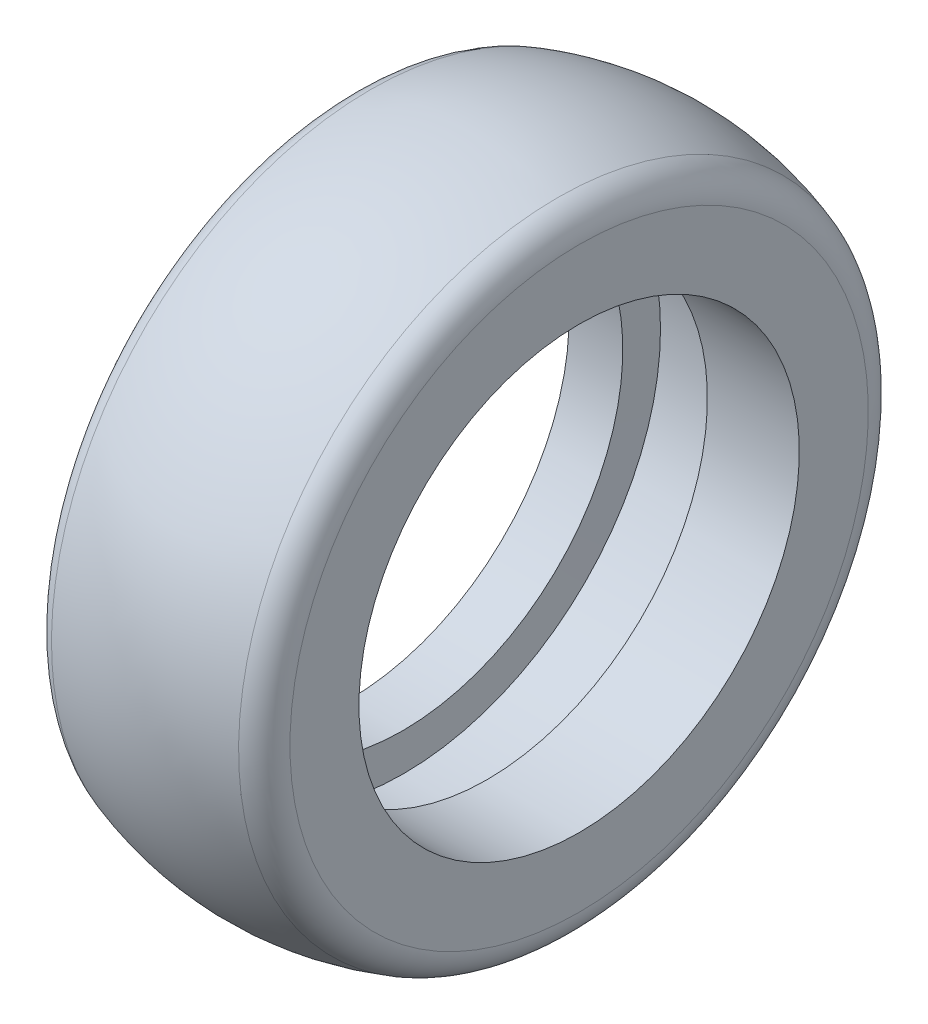
ISO-10303-21;
HEADER;
FILE_DESCRIPTION(('STEP AP214'),'2;1');
FILE_NAME('part.step','',(''),(''),'','','');
FILE_SCHEMA(('AUTOMOTIVE_DESIGN { 1 0 10303 214 1 1 1 1 }'));
ENDSEC;
DATA;
#1=APPLICATION_CONTEXT('core data for automotive mechanical design processes');
#2=APPLICATION_PROTOCOL_DEFINITION('international standard','automotive_design',2000,#1);
#3=PRODUCT_CONTEXT('',#1,'mechanical');
#4=PRODUCT('Part','Part','',(#3));
#5=PRODUCT_RELATED_PRODUCT_CATEGORY('part','',(#4));
#6=PRODUCT_DEFINITION_FORMATION('','',#4);
#7=PRODUCT_DEFINITION_CONTEXT('part definition',#1,'design');
#8=PRODUCT_DEFINITION('design','',#6,#7);
#9=PRODUCT_DEFINITION_SHAPE('','',#8);
#10=(LENGTH_UNIT() NAMED_UNIT(*) SI_UNIT(.MILLI.,.METRE.));
#11=(NAMED_UNIT(*) PLANE_ANGLE_UNIT() SI_UNIT($,.RADIAN.));
#12=(NAMED_UNIT(*) SI_UNIT($,.STERADIAN.) SOLID_ANGLE_UNIT());
#13=UNCERTAINTY_MEASURE_WITH_UNIT(LENGTH_MEASURE(1.E-05),#10,'distance_accuracy_value','');
#14=(GEOMETRIC_REPRESENTATION_CONTEXT(3) GLOBAL_UNCERTAINTY_ASSIGNED_CONTEXT((#13)) GLOBAL_UNIT_ASSIGNED_CONTEXT((#10,
#11,#12)) REPRESENTATION_CONTEXT('',''));
#15=CARTESIAN_POINT('',(0.,0.,0.));
#16=DIRECTION('',(0.,0.,1.));
#17=DIRECTION('',(1.,0.,0.));
#18=AXIS2_PLACEMENT_3D('',#15,#16,#17);
#19=CARTESIAN_POINT('',(10.,0.,0.));
#20=DIRECTION('',(-1.,0.,0.));
#21=DIRECTION('',(0.,-1.,0.));
#22=AXIS2_PLACEMENT_3D('',#19,#20,#21);
#23=PLANE('',#22);
#24=CARTESIAN_POINT('',(10.,0.,0.));
#25=DIRECTION('',(-1.,0.,0.));
#26=DIRECTION('',(0.,-1.,0.));
#27=AXIS2_PLACEMENT_3D('',#24,#25,#26);
#28=CIRCLE('',#27,276.291380332591);
#29=CARTESIAN_POINT('',(10.0000000000001,-276.291380332591,0.));
#30=VERTEX_POINT('',#29);
#31=EDGE_CURVE('E10',#30,#30,#28,.F.);
#32=ORIENTED_EDGE('',*,*,#31,.T.);
#33=EDGE_LOOP('',(#32));
#34=FACE_BOUND('',#33,.T.);
#35=CARTESIAN_POINT('',(10.,0.,0.));
#36=DIRECTION('',(1.,0.,0.));
#37=DIRECTION('',(0.,1.,0.));
#38=AXIS2_PLACEMENT_3D('',#35,#36,#37);
#39=CIRCLE('',#38,210.4);
#40=CARTESIAN_POINT('',(9.99999999999998,210.4,0.));
#41=VERTEX_POINT('',#40);
#42=EDGE_CURVE('E83',#41,#41,#39,.T.);
#43=ORIENTED_EDGE('',*,*,#42,.F.);
#44=EDGE_LOOP('',(#43));
#45=FACE_BOUND('',#44,.T.);
#46=ADVANCED_FACE('F36',(#34,#45),#23,.F.);
#47=CARTESIAN_POINT('',(9.99999999999997,297.28561704638,0.));
#48=CARTESIAN_POINT('',(7.79216066750384,298.128725714587,0.));
#49=CARTESIAN_POINT('',(5.58473045575159,298.973172440556,0.));
#50=CARTESIAN_POINT('',(1.1681965678224,300.656592711051,0.));
#51=CARTESIAN_POINT('',(-1.04748797150768,301.474043086302,0.));
#52=CARTESIAN_POINT('',(-7.71723374720625,303.852177936741,0.));
#53=CARTESIAN_POINT('',(-12.1939817440852,305.338663788524,0.));
#54=CARTESIAN_POINT('',(-21.2104461547922,308.105692918078,0.));
#55=CARTESIAN_POINT('',(-25.7501618925752,309.3862384069,0.));
#56=CARTESIAN_POINT('',(-32.6089465846834,311.146108372808,0.));
#57=CARTESIAN_POINT('',(-34.9034114720099,311.705902157117,0.));
#58=CARTESIAN_POINT('',(-39.5090975316223,312.770687133855,0.));
#59=CARTESIAN_POINT('',(-41.8218452273617,313.275989251134,0.));
#60=CARTESIAN_POINT('',(-62.6829189736741,317.565497999385,0.));
#61=CARTESIAN_POINT('',(-81.2965527164959,319.492294429797,0.));
#62=CARTESIAN_POINT('',(-109.324900449957,319.494137989365,0.));
#63=CARTESIAN_POINT('',(-118.68567140873,319.013212686543,0.));
#64=CARTESIAN_POINT('',(-130.409396195208,317.802753291168,0.));
#65=CARTESIAN_POINT('',(-132.755279330546,317.530192963942,0.));
#66=CARTESIAN_POINT('',(-137.449329338224,316.923937829716,0.));
#67=CARTESIAN_POINT('',(-139.794326034707,316.590581812891,0.));
#68=CARTESIAN_POINT('',(-146.798638913653,315.504714446676,0.));
#69=CARTESIAN_POINT('',(-151.437115247256,314.665186613561,0.));
#70=CARTESIAN_POINT('',(-165.262865698361,311.812847999143,0.));
#71=CARTESIAN_POINT('',(-174.360529260961,309.466535157863,0.));
#72=CARTESIAN_POINT('',(-187.840485903976,305.32726167899,0.));
#73=CARTESIAN_POINT('',(-192.306030579987,303.844137071968,0.));
#74=CARTESIAN_POINT('',(-198.964129964022,301.469772900077,0.));
#75=CARTESIAN_POINT('',(-201.176792548272,300.653368472101,0.));
#76=CARTESIAN_POINT('',(-205.588939804588,298.971515607169,0.));
#77=CARTESIAN_POINT('',(-207.7942938498,298.127911115237,0.));
#78=CARTESIAN_POINT('',(-210.,297.28561704638,0.));
#79=B_SPLINE_CURVE_WITH_KNOTS('',3,(#47,#48,#49,#50,#51,#52,#53,#54,#55,#56,#57,#58,#59,#60,#61,
#62,#63,#64,#65,#66,#67,#68,#69,#70,#71,#72,#73,#74,#75,#76,#77,#78),.UNSPECIFIED.,.F.,.F.,(4,2,
2,2,2,2,2,2,2,2,2,2,2,2,2,4),(0.,0.03125,0.0625,0.125,0.187499999999999,0.218749999999999,
0.249999999999999,0.499999999999999,0.624999999999999,0.656249999999999,0.687499999999999,
0.749999999999999,0.875,0.9375,0.96875,1.),.UNSPECIFIED.);
#80=CARTESIAN_POINT('',(0.,0.,0.));
#81=DIRECTION('',(1.,0.,0.));
#82=AXIS1_PLACEMENT('',#80,#81);
#83=SURFACE_OF_REVOLUTION('',#79,#82);
#84=CARTESIAN_POINT('',(-189.385652351421,0.,0.));
#85=DIRECTION('',(1.,0.,0.));
#86=DIRECTION('',(0.,1.,0.));
#87=AXIS2_PLACEMENT_3D('',#84,#85,#86);
#88=CIRCLE('',#87,304.78540551711);
#89=CARTESIAN_POINT('',(-189.385652351421,304.78540551711,0.));
#90=VERTEX_POINT('',#89);
#91=EDGE_CURVE('E47',#90,#90,#88,.T.);
#92=ORIENTED_EDGE('',*,*,#91,.T.);
#93=EDGE_LOOP('',(#92));
#94=FACE_BOUND('',#93,.T.);
#95=CARTESIAN_POINT('',(-10.6143490181166,0.,0.));
#96=DIRECTION('',(1.,0.,0.));
#97=DIRECTION('',(0.,1.,0.));
#98=AXIS2_PLACEMENT_3D('',#95,#96,#97);
#99=CIRCLE('',#98,304.785406998653);
#100=CARTESIAN_POINT('',(-10.6143490181166,304.785406998653,0.));
#101=VERTEX_POINT('',#100);
#102=EDGE_CURVE('E51',#101,#101,#99,.F.);
#103=ORIENTED_EDGE('',*,*,#102,.T.);
#104=EDGE_LOOP('',(#103));
#105=FACE_BOUND('',#104,.T.);
#106=ADVANCED_FACE('F96',(#94,#105),#83,.F.);
#107=CARTESIAN_POINT('',(-210.,0.,0.));
#108=DIRECTION('',(1.,0.,0.));
#109=DIRECTION('',(0.,1.,0.));
#110=AXIS2_PLACEMENT_3D('',#107,#108,#109);
#111=PLANE('',#110);
#112=CARTESIAN_POINT('',(-210.,0.,0.));
#113=DIRECTION('',(1.,0.,0.));
#114=DIRECTION('',(0.,1.,0.));
#115=AXIS2_PLACEMENT_3D('',#112,#113,#114);
#116=CIRCLE('',#115,276.291379302159);
#117=CARTESIAN_POINT('',(-210.,276.291379302159,0.));
#118=VERTEX_POINT('',#117);
#119=EDGE_CURVE('E43',#118,#118,#116,.F.);
#120=ORIENTED_EDGE('',*,*,#119,.T.);
#121=EDGE_LOOP('',(#120));
#122=FACE_BOUND('',#121,.T.);
#123=CARTESIAN_POINT('',(-210.,0.,0.));
#124=DIRECTION('',(1.,0.,0.));
#125=DIRECTION('',(0.,1.,0.));
#126=AXIS2_PLACEMENT_3D('',#123,#124,#125);
#127=CIRCLE('',#126,210.4);
#128=CARTESIAN_POINT('',(-210.,210.4,0.));
#129=VERTEX_POINT('',#128);
#130=EDGE_CURVE('E56',#129,#129,#127,.T.);
#131=ORIENTED_EDGE('',*,*,#130,.T.);
#132=EDGE_LOOP('',(#131));
#133=FACE_BOUND('',#132,.T.);
#134=ADVANCED_FACE('F100',(#122,#133),#111,.F.);
#135=CARTESIAN_POINT('',(0.,0.,0.));
#136=DIRECTION('',(1.,0.,0.));
#137=DIRECTION('',(0.,1.,0.));
#138=AXIS2_PLACEMENT_3D('',#135,#136,#137);
#139=CYLINDRICAL_SURFACE('',#138,210.4);
#140=CARTESIAN_POINT('',(-158.651375690543,0.,0.));
#141=DIRECTION('',(1.,0.,0.));
#142=DIRECTION('',(0.,1.,0.));
#143=AXIS2_PLACEMENT_3D('',#140,#141,#142);
#144=CIRCLE('',#143,210.4);
#145=CARTESIAN_POINT('',(-158.651375690543,210.4,0.));
#146=VERTEX_POINT('',#145);
#147=EDGE_CURVE('E59',#146,#146,#144,.T.);
#148=ORIENTED_EDGE('',*,*,#147,.T.);
#149=EDGE_LOOP('',(#148));
#150=FACE_BOUND('',#149,.T.);
#151=ORIENTED_EDGE('',*,*,#130,.F.);
#152=EDGE_LOOP('',(#151));
#153=FACE_BOUND('',#152,.T.);
#154=ADVANCED_FACE('F154',(#150,#153),#139,.F.);
#155=CARTESIAN_POINT('',(-158.651375690543,0.,0.));
#156=DIRECTION('',(1.,0.,0.));
#157=DIRECTION('',(0.,1.,0.));
#158=AXIS2_PLACEMENT_3D('',#155,#156,#157);
#159=CONICAL_SURFACE('',#158,210.4,1.54255746066031);
#160=CARTESIAN_POINT('',(-157.661946915243,0.,0.));
#161=DIRECTION('',(1.,0.,0.));
#162=DIRECTION('',(0.,1.,0.));
#163=AXIS2_PLACEMENT_3D('',#160,#161,#162);
#164=CIRCLE('',#163,245.428522581815);
#165=CARTESIAN_POINT('',(-157.661946915244,245.428522581815,0.));
#166=VERTEX_POINT('',#165);
#167=EDGE_CURVE('E62',#166,#166,#164,.T.);
#168=ORIENTED_EDGE('',*,*,#167,.T.);
#169=EDGE_LOOP('',(#168));
#170=FACE_BOUND('',#169,.T.);
#171=ORIENTED_EDGE('',*,*,#147,.F.);
#172=EDGE_LOOP('',(#171));
#173=FACE_BOUND('',#172,.T.);
#174=ADVANCED_FACE('F151',(#170,#173),#159,.F.);
#175=CARTESIAN_POINT('',(0.,0.,0.));
#176=DIRECTION('',(1.,0.,0.));
#177=DIRECTION('',(0.,1.,0.));
#178=AXIS2_PLACEMENT_3D('',#175,#176,#177);
#179=CYLINDRICAL_SURFACE('',#178,245.428522581815);
#180=CARTESIAN_POINT('',(-175.030701799025,0.,0.));
#181=DIRECTION('',(1.,0.,0.));
#182=DIRECTION('',(0.,1.,0.));
#183=AXIS2_PLACEMENT_3D('',#180,#181,#182);
#184=CIRCLE('',#183,245.428522581815);
#185=CARTESIAN_POINT('',(-175.030701799025,245.428522581815,0.));
#186=VERTEX_POINT('',#185);
#187=EDGE_CURVE('E65',#186,#186,#184,.T.);
#188=ORIENTED_EDGE('',*,*,#187,.T.);
#189=EDGE_LOOP('',(#188));
#190=FACE_BOUND('',#189,.T.);
#191=ORIENTED_EDGE('',*,*,#167,.F.);
#192=EDGE_LOOP('',(#191));
#193=FACE_BOUND('',#192,.T.);
#194=ADVANCED_FACE('F147',(#190,#193),#179,.T.);
#195=CARTESIAN_POINT('',(-175.030701799025,0.,0.));
#196=DIRECTION('',(1.,0.,0.));
#197=DIRECTION('',(0.,1.,0.));
#198=AXIS2_PLACEMENT_3D('',#195,#196,#197);
#199=PLANE('',#198);
#200=CARTESIAN_POINT('',(-175.030701799025,0.,0.));
#201=DIRECTION('',(1.,0.,0.));
#202=DIRECTION('',(0.,1.,0.));
#203=AXIS2_PLACEMENT_3D('',#200,#201,#202);
#204=CIRCLE('',#203,247.143432697392);
#205=CARTESIAN_POINT('',(-175.030701799025,247.143432697392,0.));
#206=VERTEX_POINT('',#205);
#207=EDGE_CURVE('E68',#206,#206,#204,.T.);
#208=ORIENTED_EDGE('',*,*,#207,.T.);
#209=EDGE_LOOP('',(#208));
#210=FACE_BOUND('',#209,.T.);
#211=ORIENTED_EDGE('',*,*,#187,.F.);
#212=EDGE_LOOP('',(#211));
#213=FACE_BOUND('',#212,.T.);
#214=ADVANCED_FACE('F143',(#210,#213),#199,.T.);
#215=CARTESIAN_POINT('',(0.,0.,0.));
#216=DIRECTION('',(1.,0.,0.));
#217=DIRECTION('',(0.,1.,0.));
#218=AXIS2_PLACEMENT_3D('',#215,#216,#217);
#219=CYLINDRICAL_SURFACE('',#218,247.143432697392);
#220=CARTESIAN_POINT('',(-18.4799834277993,0.,0.));
#221=DIRECTION('',(1.,0.,0.));
#222=DIRECTION('',(0.,1.,0.));
#223=AXIS2_PLACEMENT_3D('',#220,#221,#222);
#224=CIRCLE('',#223,247.143432697392);
#225=CARTESIAN_POINT('',(-18.4799834277993,247.143432697392,0.));
#226=VERTEX_POINT('',#225);
#227=EDGE_CURVE('E71',#226,#226,#224,.T.);
#228=ORIENTED_EDGE('',*,*,#227,.T.);
#229=EDGE_LOOP('',(#228));
#230=FACE_BOUND('',#229,.T.);
#231=ORIENTED_EDGE('',*,*,#207,.F.);
#232=EDGE_LOOP('',(#231));
#233=FACE_BOUND('',#232,.T.);
#234=ADVANCED_FACE('F139',(#230,#233),#219,.F.);
#235=CARTESIAN_POINT('',(-18.4799834277993,0.,0.));
#236=DIRECTION('',(1.,0.,0.));
#237=DIRECTION('',(0.,1.,0.));
#238=AXIS2_PLACEMENT_3D('',#235,#236,#237);
#239=PLANE('',#238);
#240=ORIENTED_EDGE('',*,*,#227,.F.);
#241=EDGE_LOOP('',(#240));
#242=FACE_BOUND('',#241,.T.);
#243=CARTESIAN_POINT('',(-18.4799834277993,0.,0.));
#244=DIRECTION('',(1.,0.,0.));
#245=DIRECTION('',(0.,1.,0.));
#246=AXIS2_PLACEMENT_3D('',#243,#244,#245);
#247=CIRCLE('',#246,245.428522581815);
#248=CARTESIAN_POINT('',(-18.4799834277993,245.428522581815,0.));
#249=VERTEX_POINT('',#248);
#250=EDGE_CURVE('E74',#249,#249,#247,.T.);
#251=ORIENTED_EDGE('',*,*,#250,.T.);
#252=EDGE_LOOP('',(#251));
#253=FACE_BOUND('',#252,.T.);
#254=ADVANCED_FACE('F135',(#242,#253),#239,.F.);
#255=CARTESIAN_POINT('',(0.,0.,0.));
#256=DIRECTION('',(1.,0.,0.));
#257=DIRECTION('',(0.,1.,0.));
#258=AXIS2_PLACEMENT_3D('',#255,#256,#257);
#259=CYLINDRICAL_SURFACE('',#258,245.428522581815);
#260=ORIENTED_EDGE('',*,*,#250,.F.);
#261=EDGE_LOOP('',(#260));
#262=FACE_BOUND('',#261,.T.);
#263=CARTESIAN_POINT('',(-77.8156295397426,0.,0.));
#264=DIRECTION('',(1.,0.,0.));
#265=DIRECTION('',(0.,1.,0.));
#266=AXIS2_PLACEMENT_3D('',#263,#264,#265);
#267=CIRCLE('',#266,245.428522581815);
#268=CARTESIAN_POINT('',(-77.8156295397426,245.428522581815,0.));
#269=VERTEX_POINT('',#268);
#270=EDGE_CURVE('E77',#269,#269,#267,.T.);
#271=ORIENTED_EDGE('',*,*,#270,.T.);
#272=EDGE_LOOP('',(#271));
#273=FACE_BOUND('',#272,.T.);
#274=ADVANCED_FACE('F124',(#262,#273),#259,.T.);
#275=CARTESIAN_POINT('',(-77.8156295397426,0.,0.));
#276=DIRECTION('',(1.,0.,0.));
#277=DIRECTION('',(0.,1.,0.));
#278=AXIS2_PLACEMENT_3D('',#275,#276,#277);
#279=PLANE('',#278);
#280=ORIENTED_EDGE('',*,*,#270,.F.);
#281=EDGE_LOOP('',(#280));
#282=FACE_BOUND('',#281,.T.);
#283=CARTESIAN_POINT('',(-77.8156295397426,0.,0.));
#284=DIRECTION('',(1.,0.,0.));
#285=DIRECTION('',(0.,1.,0.));
#286=AXIS2_PLACEMENT_3D('',#283,#284,#285);
#287=CIRCLE('',#286,210.4);
#288=CARTESIAN_POINT('',(-77.8156295397426,210.4,0.));
#289=VERTEX_POINT('',#288);
#290=EDGE_CURVE('E80',#289,#289,#287,.T.);
#291=ORIENTED_EDGE('',*,*,#290,.T.);
#292=EDGE_LOOP('',(#291));
#293=FACE_BOUND('',#292,.T.);
#294=ADVANCED_FACE('F113',(#282,#293),#279,.F.);
#295=CARTESIAN_POINT('',(0.,0.,0.));
#296=DIRECTION('',(1.,0.,0.));
#297=DIRECTION('',(0.,1.,0.));
#298=AXIS2_PLACEMENT_3D('',#295,#296,#297);
#299=CYLINDRICAL_SURFACE('',#298,210.4);
#300=ORIENTED_EDGE('',*,*,#290,.F.);
#301=EDGE_LOOP('',(#300));
#302=FACE_BOUND('',#301,.T.);
#303=ORIENTED_EDGE('',*,*,#42,.T.);
#304=EDGE_LOOP('',(#303));
#305=FACE_BOUND('',#304,.T.);
#306=ADVANCED_FACE('F106',(#302,#305),#299,.F.);
#307=CARTESIAN_POINT('',(-180.000000000001,0.,0.));
#308=DIRECTION('',(1.,0.,0.));
#309=DIRECTION('',(0.,1.,0.));
#310=AXIS2_PLACEMENT_3D('',#307,#308,#309);
#311=TOROIDAL_SURFACE('',#310,276.291379302159,30.);
#312=ORIENTED_EDGE('',*,*,#119,.F.);
#313=EDGE_LOOP('',(#312));
#314=FACE_BOUND('',#313,.T.);
#315=ORIENTED_EDGE('',*,*,#91,.F.);
#316=EDGE_LOOP('',(#315));
#317=FACE_BOUND('',#316,.T.);
#318=ADVANCED_FACE('F104',(#314,#317),#311,.T.);
#319=CARTESIAN_POINT('',(-20.0000000000003,0.,0.));
#320=DIRECTION('',(1.,0.,0.));
#321=DIRECTION('',(0.,1.,0.));
#322=AXIS2_PLACEMENT_3D('',#319,#320,#321);
#323=TOROIDAL_SURFACE('',#322,276.291380332591,30.);
#324=ORIENTED_EDGE('',*,*,#102,.F.);
#325=EDGE_LOOP('',(#324));
#326=FACE_BOUND('',#325,.T.);
#327=ORIENTED_EDGE('',*,*,#31,.F.);
#328=EDGE_LOOP('',(#327));
#329=FACE_BOUND('',#328,.T.);
#330=ADVANCED_FACE('F38',(#326,#329),#323,.T.);
#331=CLOSED_SHELL('',(#46,#106,#134,#154,#174,#194,#214,#234,#254,#274,#294,#306,#318,#330));
#332=CARTESIAN_POINT('',(0.,0.,0.));
#333=DIRECTION('',(-1.,0.,0.));
#334=DIRECTION('',(0.,-1.,0.));
#335=AXIS2_PLACEMENT_3D('',#332,#333,#334);
#336=PLANE('',#335);
#337=CARTESIAN_POINT('',(0.,0.,0.));
#338=DIRECTION('',(1.,0.,0.));
#339=DIRECTION('',(0.,1.,0.));
#340=AXIS2_PLACEMENT_3D('',#337,#338,#339);
#341=CIRCLE('',#340,220.4);
#342=CARTESIAN_POINT('',(0.,220.4,0.));
#343=VERTEX_POINT('',#342);
#344=EDGE_CURVE('E86',#343,#343,#341,.T.);
#345=ORIENTED_EDGE('',*,*,#344,.T.);
#346=EDGE_LOOP('',(#345));
#347=FACE_BOUND('',#346,.T.);
#348=CARTESIAN_POINT('',(0.,0.,0.));
#349=DIRECTION('',(1.,0.,0.));
#350=DIRECTION('',(0.,1.,0.));
#351=AXIS2_PLACEMENT_3D('',#348,#349,#350);
#352=CIRCLE('',#351,290.4);
#353=CARTESIAN_POINT('',(0.,290.4,0.));
#354=VERTEX_POINT('',#353);
#355=EDGE_CURVE('E378',#354,#354,#352,.T.);
#356=ORIENTED_EDGE('',*,*,#355,.F.);
#357=EDGE_LOOP('',(#356));
#358=FACE_BOUND('',#357,.T.);
#359=ADVANCED_FACE('F130',(#347,#358),#336,.T.);
#360=CARTESIAN_POINT('',(0.,0.,0.));
#361=DIRECTION('',(1.,0.,0.));
#362=DIRECTION('',(0.,1.,0.));
#363=AXIS2_PLACEMENT_3D('',#360,#361,#362);
#364=CYLINDRICAL_SURFACE('',#363,220.4);
#365=CARTESIAN_POINT('',(-67.8156295397426,0.,0.));
#366=DIRECTION('',(1.,0.,0.));
#367=DIRECTION('',(0.,1.,0.));
#368=AXIS2_PLACEMENT_3D('',#365,#366,#367);
#369=CIRCLE('',#368,220.4);
#370=CARTESIAN_POINT('',(-67.8156295397426,220.4,0.));
#371=VERTEX_POINT('',#370);
#372=EDGE_CURVE('E412',#371,#371,#369,.T.);
#373=ORIENTED_EDGE('',*,*,#372,.T.);
#374=EDGE_LOOP('',(#373));
#375=FACE_BOUND('',#374,.T.);
#376=ORIENTED_EDGE('',*,*,#344,.F.);
#377=EDGE_LOOP('',(#376));
#378=FACE_BOUND('',#377,.T.);
#379=ADVANCED_FACE('F279',(#375,#378),#364,.T.);
#380=CARTESIAN_POINT('',(-67.8156295397426,0.,0.));
#381=DIRECTION('',(1.,0.,0.));
#382=DIRECTION('',(0.,1.,0.));
#383=AXIS2_PLACEMENT_3D('',#380,#381,#382);
#384=PLANE('',#383);
#385=CARTESIAN_POINT('',(-67.8156295397426,0.,0.));
#386=DIRECTION('',(1.,0.,0.));
#387=DIRECTION('',(0.,1.,0.));
#388=AXIS2_PLACEMENT_3D('',#385,#386,#387);
#389=CIRCLE('',#388,235.428522581815);
#390=CARTESIAN_POINT('',(-67.8156295397426,235.428522581815,0.));
#391=VERTEX_POINT('',#390);
#392=EDGE_CURVE('E410',#391,#391,#389,.T.);
#393=ORIENTED_EDGE('',*,*,#392,.T.);
#394=EDGE_LOOP('',(#393));
#395=FACE_BOUND('',#394,.T.);
#396=ORIENTED_EDGE('',*,*,#372,.F.);
#397=EDGE_LOOP('',(#396));
#398=FACE_BOUND('',#397,.T.);
#399=ADVANCED_FACE('F269',(#395,#398),#384,.T.);
#400=CARTESIAN_POINT('',(0.,0.,0.));
#401=DIRECTION('',(1.,0.,0.));
#402=DIRECTION('',(0.,1.,0.));
#403=AXIS2_PLACEMENT_3D('',#400,#401,#402);
#404=CYLINDRICAL_SURFACE('',#403,235.428522581815);
#405=CARTESIAN_POINT('',(-8.47998342779928,0.,0.));
#406=DIRECTION('',(1.,0.,0.));
#407=DIRECTION('',(0.,1.,0.));
#408=AXIS2_PLACEMENT_3D('',#405,#406,#407);
#409=CIRCLE('',#408,235.428522581815);
#410=CARTESIAN_POINT('',(-8.47998342779932,235.428522581815,0.));
#411=VERTEX_POINT('',#410);
#412=EDGE_CURVE('E407',#411,#411,#409,.T.);
#413=ORIENTED_EDGE('',*,*,#412,.T.);
#414=EDGE_LOOP('',(#413));
#415=FACE_BOUND('',#414,.T.);
#416=ORIENTED_EDGE('',*,*,#392,.F.);
#417=EDGE_LOOP('',(#416));
#418=FACE_BOUND('',#417,.T.);
#419=ADVANCED_FACE('F259',(#415,#418),#404,.F.);
#420=CARTESIAN_POINT('',(-8.47998342779928,0.,0.));
#421=DIRECTION('',(1.,0.,0.));
#422=DIRECTION('',(0.,1.,0.));
#423=AXIS2_PLACEMENT_3D('',#420,#421,#422);
#424=PLANE('',#423);
#425=CARTESIAN_POINT('',(-8.47998342779928,0.,0.));
#426=DIRECTION('',(1.,0.,0.));
#427=DIRECTION('',(0.,1.,0.));
#428=AXIS2_PLACEMENT_3D('',#425,#426,#427);
#429=CIRCLE('',#428,257.143432697392);
#430=CARTESIAN_POINT('',(-8.47998342779932,257.143432697392,0.));
#431=VERTEX_POINT('',#430);
#432=EDGE_CURVE('E404',#431,#431,#429,.T.);
#433=ORIENTED_EDGE('',*,*,#432,.T.);
#434=EDGE_LOOP('',(#433));
#435=FACE_BOUND('',#434,.T.);
#436=ORIENTED_EDGE('',*,*,#412,.F.);
#437=EDGE_LOOP('',(#436));
#438=FACE_BOUND('',#437,.T.);
#439=ADVANCED_FACE('F249',(#435,#438),#424,.T.);
#440=CARTESIAN_POINT('',(0.,0.,0.));
#441=DIRECTION('',(1.,0.,0.));
#442=DIRECTION('',(0.,1.,0.));
#443=AXIS2_PLACEMENT_3D('',#440,#441,#442);
#444=CYLINDRICAL_SURFACE('',#443,257.143432697392);
#445=ORIENTED_EDGE('',*,*,#432,.F.);
#446=EDGE_LOOP('',(#445));
#447=FACE_BOUND('',#446,.T.);
#448=CARTESIAN_POINT('',(-185.030701799025,0.,0.));
#449=DIRECTION('',(1.,0.,0.));
#450=DIRECTION('',(0.,1.,0.));
#451=AXIS2_PLACEMENT_3D('',#448,#449,#450);
#452=CIRCLE('',#451,257.143432697392);
#453=CARTESIAN_POINT('',(-185.030701799025,257.143432697392,0.));
#454=VERTEX_POINT('',#453);
#455=EDGE_CURVE('E401',#454,#454,#452,.T.);
#456=ORIENTED_EDGE('',*,*,#455,.T.);
#457=EDGE_LOOP('',(#456));
#458=FACE_BOUND('',#457,.T.);
#459=ADVANCED_FACE('F239',(#447,#458),#444,.T.);
#460=CARTESIAN_POINT('',(-185.030701799025,0.,0.));
#461=DIRECTION('',(1.,0.,0.));
#462=DIRECTION('',(0.,1.,0.));
#463=AXIS2_PLACEMENT_3D('',#460,#461,#462);
#464=PLANE('',#463);
#465=ORIENTED_EDGE('',*,*,#455,.F.);
#466=EDGE_LOOP('',(#465));
#467=FACE_BOUND('',#466,.T.);
#468=CARTESIAN_POINT('',(-185.030701799025,0.,0.));
#469=DIRECTION('',(1.,0.,0.));
#470=DIRECTION('',(0.,1.,0.));
#471=AXIS2_PLACEMENT_3D('',#468,#469,#470);
#472=CIRCLE('',#471,235.428522581815);
#473=CARTESIAN_POINT('',(-185.030701799025,235.428522581815,0.));
#474=VERTEX_POINT('',#473);
#475=EDGE_CURVE('E398',#474,#474,#472,.T.);
#476=ORIENTED_EDGE('',*,*,#475,.T.);
#477=EDGE_LOOP('',(#476));
#478=FACE_BOUND('',#477,.T.);
#479=ADVANCED_FACE('F229',(#467,#478),#464,.F.);
#480=CARTESIAN_POINT('',(0.,0.,0.));
#481=DIRECTION('',(1.,0.,0.));
#482=DIRECTION('',(0.,1.,0.));
#483=AXIS2_PLACEMENT_3D('',#480,#481,#482);
#484=CYLINDRICAL_SURFACE('',#483,235.428522581815);
#485=ORIENTED_EDGE('',*,*,#475,.F.);
#486=EDGE_LOOP('',(#485));
#487=FACE_BOUND('',#486,.T.);
#488=CARTESIAN_POINT('',(-167.94839915563,0.,0.));
#489=DIRECTION('',(1.,0.,0.));
#490=DIRECTION('',(0.,1.,0.));
#491=AXIS2_PLACEMENT_3D('',#488,#489,#490);
#492=CIRCLE('',#491,235.428522581815);
#493=CARTESIAN_POINT('',(-167.94839915563,235.428522581815,0.));
#494=VERTEX_POINT('',#493);
#495=EDGE_CURVE('E395',#494,#494,#492,.T.);
#496=ORIENTED_EDGE('',*,*,#495,.T.);
#497=EDGE_LOOP('',(#496));
#498=FACE_BOUND('',#497,.T.);
#499=ADVANCED_FACE('F219',(#487,#498),#484,.F.);
#500=CARTESIAN_POINT('',(-168.372900436207,0.,0.));
#501=DIRECTION('',(1.,0.,0.));
#502=DIRECTION('',(0.,1.,0.));
#503=AXIS2_PLACEMENT_3D('',#500,#501,#502);
#504=CONICAL_SURFACE('',#503,220.4,1.54255746066031);
#505=ORIENTED_EDGE('',*,*,#495,.F.);
#506=EDGE_LOOP('',(#505));
#507=FACE_BOUND('',#506,.T.);
#508=CARTESIAN_POINT('',(-168.372900436207,0.,0.));
#509=DIRECTION('',(1.,0.,0.));
#510=DIRECTION('',(0.,1.,0.));
#511=AXIS2_PLACEMENT_3D('',#508,#509,#510);
#512=CIRCLE('',#511,220.4);
#513=CARTESIAN_POINT('',(-168.372900436207,220.4,0.));
#514=VERTEX_POINT('',#513);
#515=EDGE_CURVE('E392',#514,#514,#512,.T.);
#516=ORIENTED_EDGE('',*,*,#515,.T.);
#517=EDGE_LOOP('',(#516));
#518=FACE_BOUND('',#517,.T.);
#519=ADVANCED_FACE('F208',(#507,#518),#504,.T.);
#520=CARTESIAN_POINT('',(0.,0.,0.));
#521=DIRECTION('',(1.,0.,0.));
#522=DIRECTION('',(0.,1.,0.));
#523=AXIS2_PLACEMENT_3D('',#520,#521,#522);
#524=CYLINDRICAL_SURFACE('',#523,220.4);
#525=ORIENTED_EDGE('',*,*,#515,.F.);
#526=EDGE_LOOP('',(#525));
#527=FACE_BOUND('',#526,.T.);
#528=CARTESIAN_POINT('',(-200.,0.,0.));
#529=DIRECTION('',(1.,0.,0.));
#530=DIRECTION('',(0.,1.,0.));
#531=AXIS2_PLACEMENT_3D('',#528,#529,#530);
#532=CIRCLE('',#531,220.4);
#533=CARTESIAN_POINT('',(-200.,220.4,0.));
#534=VERTEX_POINT('',#533);
#535=EDGE_CURVE('E383',#534,#534,#532,.T.);
#536=ORIENTED_EDGE('',*,*,#535,.T.);
#537=EDGE_LOOP('',(#536));
#538=FACE_BOUND('',#537,.T.);
#539=ADVANCED_FACE('F198',(#527,#538),#524,.T.);
#540=CARTESIAN_POINT('',(-200.,0.,0.));
#541=DIRECTION('',(1.,0.,0.));
#542=DIRECTION('',(0.,1.,0.));
#543=AXIS2_PLACEMENT_3D('',#540,#541,#542);
#544=PLANE('',#543);
#545=CARTESIAN_POINT('',(-200.,0.,0.));
#546=DIRECTION('',(1.,0.,0.));
#547=DIRECTION('',(0.,1.,0.));
#548=AXIS2_PLACEMENT_3D('',#545,#546,#547);
#549=CIRCLE('',#548,290.4);
#550=CARTESIAN_POINT('',(-200.,290.4,0.));
#551=VERTEX_POINT('',#550);
#552=EDGE_CURVE('E380',#551,#551,#549,.T.);
#553=ORIENTED_EDGE('',*,*,#552,.T.);
#554=EDGE_LOOP('',(#553));
#555=FACE_BOUND('',#554,.T.);
#556=ORIENTED_EDGE('',*,*,#535,.F.);
#557=EDGE_LOOP('',(#556));
#558=FACE_BOUND('',#557,.T.);
#559=ADVANCED_FACE('F186',(#555,#558),#544,.T.);
#560=CARTESIAN_POINT('',(0.,290.4,0.));
#561=CARTESIAN_POINT('',(-100.,328.587048115212,0.));
#562=CARTESIAN_POINT('',(-200.,290.4,0.));
#563=B_SPLINE_CURVE_WITH_KNOTS('',2,(#560,#561,#562),.UNSPECIFIED.,.F.,.F.,(3,3),(0.,1.),.UNSPECIFIED.);
#564=CARTESIAN_POINT('',(0.,0.,0.));
#565=DIRECTION('',(1.,0.,0.));
#566=AXIS1_PLACEMENT('',#564,#565);
#567=SURFACE_OF_REVOLUTION('',#563,#566);
#568=ORIENTED_EDGE('',*,*,#552,.F.);
#569=EDGE_LOOP('',(#568));
#570=FACE_BOUND('',#569,.T.);
#571=ORIENTED_EDGE('',*,*,#355,.T.);
#572=EDGE_LOOP('',(#571));
#573=FACE_BOUND('',#572,.T.);
#574=ADVANCED_FACE('F181',(#570,#573),#567,.T.);
#575=CLOSED_SHELL('',(#359,#379,#399,#419,#439,#459,#479,#499,#519,#539,#559,#574));
#576=ORIENTED_CLOSED_SHELL('',*,#575,.T.);
#577=BREP_WITH_VOIDS('B2',#331,(#576));
#578=ADVANCED_BREP_SHAPE_REPRESENTATION('',(#18,#577),#14);
#579=SHAPE_DEFINITION_REPRESENTATION(#9,#578);
ENDSEC;
END-ISO-10303-21;
